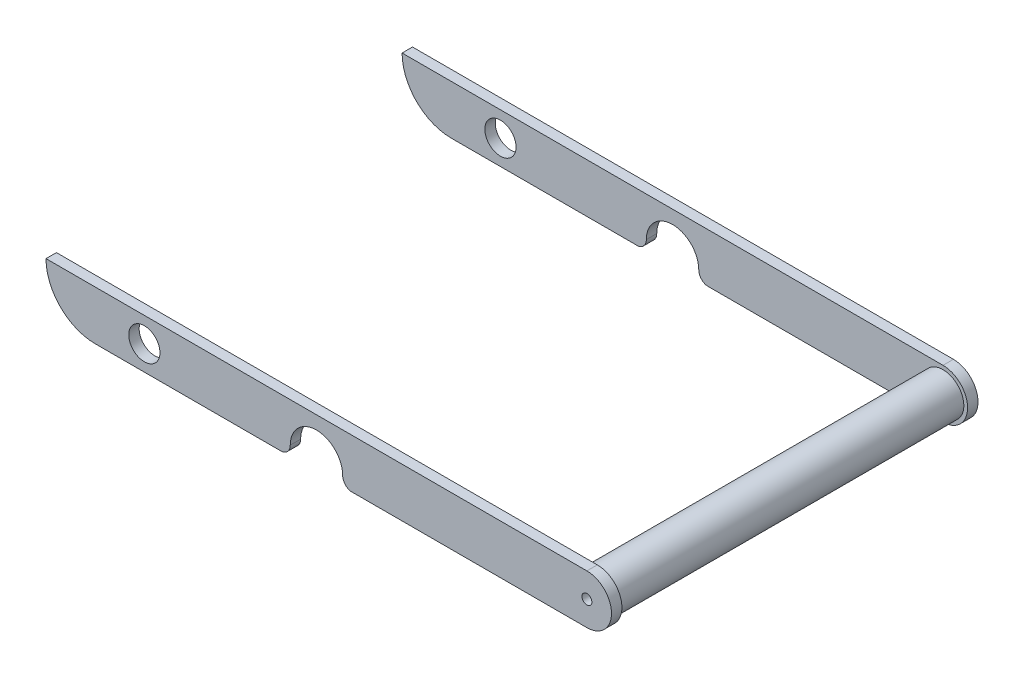
ISO-10303-21;
HEADER;
FILE_DESCRIPTION(('STEP AP214'),'2;1');
FILE_NAME('part.step','',(''),(''),'','','');
FILE_SCHEMA(('AUTOMOTIVE_DESIGN { 1 0 10303 214 1 1 1 1 }'));
ENDSEC;
DATA;
#1=APPLICATION_CONTEXT('core data for automotive mechanical design processes');
#2=APPLICATION_PROTOCOL_DEFINITION('international standard','automotive_design',2000,#1);
#3=PRODUCT_CONTEXT('',#1,'mechanical');
#4=PRODUCT('Part','Part','',(#3));
#5=PRODUCT_RELATED_PRODUCT_CATEGORY('part','',(#4));
#6=PRODUCT_DEFINITION_FORMATION('','',#4);
#7=PRODUCT_DEFINITION_CONTEXT('part definition',#1,'design');
#8=PRODUCT_DEFINITION('design','',#6,#7);
#9=PRODUCT_DEFINITION_SHAPE('','',#8);
#10=(LENGTH_UNIT() NAMED_UNIT(*) SI_UNIT(.MILLI.,.METRE.));
#11=(NAMED_UNIT(*) PLANE_ANGLE_UNIT() SI_UNIT($,.RADIAN.));
#12=(NAMED_UNIT(*) SI_UNIT($,.STERADIAN.) SOLID_ANGLE_UNIT());
#13=UNCERTAINTY_MEASURE_WITH_UNIT(LENGTH_MEASURE(1.E-05),#10,'distance_accuracy_value','');
#14=(GEOMETRIC_REPRESENTATION_CONTEXT(3) GLOBAL_UNCERTAINTY_ASSIGNED_CONTEXT((#13)) GLOBAL_UNIT_ASSIGNED_CONTEXT((#10,
#11,#12)) REPRESENTATION_CONTEXT('',''));
#15=CARTESIAN_POINT('',(0.,0.,0.));
#16=DIRECTION('',(0.,0.,1.));
#17=DIRECTION('',(1.,0.,0.));
#18=AXIS2_PLACEMENT_3D('',#15,#16,#17);
#19=CARTESIAN_POINT('',(0.,0.,3.175));
#20=DIRECTION('',(0.,1.,0.));
#21=DIRECTION('',(0.,0.,1.));
#22=AXIS2_PLACEMENT_3D('',#19,#20,#21);
#23=PLANE('',#22);
#24=DIRECTION('',(1.,0.,0.));
#25=VECTOR('',#24,1.);
#26=CARTESIAN_POINT('',(0.,0.,0.));
#27=LINE('',#26,#25);
#28=CARTESIAN_POINT('',(0.,0.,0.));
#29=VERTEX_POINT('',#28);
#30=CARTESIAN_POINT('',(57.0175182557869,0.,0.));
#31=VERTEX_POINT('',#30);
#32=EDGE_CURVE('E164',#29,#31,#27,.T.);
#33=ORIENTED_EDGE('',*,*,#32,.T.);
#34=DIRECTION('',(0.,0.,1.));
#35=VECTOR('',#34,1.);
#36=CARTESIAN_POINT('',(57.0175182557869,0.,0.));
#37=LINE('',#36,#35);
#38=CARTESIAN_POINT('',(57.0175182557869,0.,3.175));
#39=VERTEX_POINT('',#38);
#40=EDGE_CURVE('E146',#31,#39,#37,.T.);
#41=ORIENTED_EDGE('',*,*,#40,.T.);
#42=DIRECTION('',(1.,0.,0.));
#43=VECTOR('',#42,1.);
#44=CARTESIAN_POINT('',(0.,0.,3.175));
#45=LINE('',#44,#43);
#46=CARTESIAN_POINT('',(0.,0.,3.175));
#47=VERTEX_POINT('',#46);
#48=EDGE_CURVE('E260',#47,#39,#45,.T.);
#49=ORIENTED_EDGE('',*,*,#48,.F.);
#50=DIRECTION('',(0.,0.,-1.));
#51=VECTOR('',#50,1.);
#52=CARTESIAN_POINT('',(0.,0.,3.175));
#53=LINE('',#52,#51);
#54=EDGE_CURVE('E170',#47,#29,#53,.T.);
#55=ORIENTED_EDGE('',*,*,#54,.T.);
#56=EDGE_LOOP('',(#33,#41,#49,#55));
#57=FACE_BOUND('',#56,.T.);
#58=ADVANCED_FACE('F33',(#57),#23,.F.);
#59=CARTESIAN_POINT('',(0.,0.,111.7992));
#60=DIRECTION('',(0.,1.,0.));
#61=DIRECTION('',(0.,0.,1.));
#62=AXIS2_PLACEMENT_3D('',#59,#60,#61);
#63=PLANE('',#62);
#64=DIRECTION('',(1.,0.,0.));
#65=VECTOR('',#64,1.);
#66=CARTESIAN_POINT('',(0.,0.,108.6242));
#67=LINE('',#66,#65);
#68=CARTESIAN_POINT('',(0.,0.,108.6242));
#69=VERTEX_POINT('',#68);
#70=CARTESIAN_POINT('',(57.0175182557869,0.,108.6242));
#71=VERTEX_POINT('',#70);
#72=EDGE_CURVE('E206',#69,#71,#67,.T.);
#73=ORIENTED_EDGE('',*,*,#72,.T.);
#74=DIRECTION('',(0.,0.,1.));
#75=VECTOR('',#74,1.);
#76=CARTESIAN_POINT('',(57.0175182557869,0.,0.));
#77=LINE('',#76,#75);
#78=CARTESIAN_POINT('',(57.0175182557869,0.,111.7992));
#79=VERTEX_POINT('',#78);
#80=EDGE_CURVE('E41',#71,#79,#77,.T.);
#81=ORIENTED_EDGE('',*,*,#80,.T.);
#82=DIRECTION('',(1.,0.,0.));
#83=VECTOR('',#82,1.);
#84=CARTESIAN_POINT('',(0.,0.,111.7992));
#85=LINE('',#84,#83);
#86=CARTESIAN_POINT('',(0.,0.,111.7992));
#87=VERTEX_POINT('',#86);
#88=EDGE_CURVE('E204',#87,#79,#85,.T.);
#89=ORIENTED_EDGE('',*,*,#88,.F.);
#90=DIRECTION('',(0.,0.,-1.));
#91=VECTOR('',#90,1.);
#92=CARTESIAN_POINT('',(0.,0.,111.7992));
#93=LINE('',#92,#91);
#94=EDGE_CURVE('E246',#87,#69,#93,.T.);
#95=ORIENTED_EDGE('',*,*,#94,.T.);
#96=EDGE_LOOP('',(#73,#81,#89,#95));
#97=FACE_BOUND('',#96,.T.);
#98=ADVANCED_FACE('F202',(#97),#63,.F.);
#99=CARTESIAN_POINT('',(0.,15.,3.175));
#100=DIRECTION('',(0.,0.,-1.));
#101=DIRECTION('',(-1.,0.,0.));
#102=AXIS2_PLACEMENT_3D('',#99,#100,#101);
#103=PLANE('',#102);
#104=CARTESIAN_POINT('',(150.,7.5,3.175));
#105=DIRECTION('',(0.,0.,-1.));
#106=DIRECTION('',(-1.,0.,0.));
#107=AXIS2_PLACEMENT_3D('',#104,#105,#106);
#108=CIRCLE('',#107,6.35);
#109=CARTESIAN_POINT('',(143.65,7.5,3.175));
#110=VERTEX_POINT('',#109);
#111=EDGE_CURVE('E194',#110,#110,#108,.F.);
#112=ORIENTED_EDGE('',*,*,#111,.F.);
#113=EDGE_LOOP('',(#112));
#114=FACE_BOUND('',#113,.T.);
#115=ORIENTED_EDGE('',*,*,#48,.T.);
#116=CARTESIAN_POINT('',(56.5,2.95502535605488,3.175));
#117=DIRECTION('',(0.,0.,-1.));
#118=DIRECTION('',(-1.,0.,0.));
#119=AXIS2_PLACEMENT_3D('',#116,#117,#118);
#120=CIRCLE('',#119,3.);
#121=CARTESIAN_POINT('',(59.5,2.95502535605489,3.175));
#122=VERTEX_POINT('',#121);
#123=EDGE_CURVE('E153',#39,#122,#120,.F.);
#124=ORIENTED_EDGE('',*,*,#123,.T.);
#125=CARTESIAN_POINT('',(67.5,2.95502535605488,3.175));
#126=DIRECTION('',(0.,0.,-1.));
#127=DIRECTION('',(-1.,0.,0.));
#128=AXIS2_PLACEMENT_3D('',#125,#126,#127);
#129=CIRCLE('',#128,8.);
#130=CARTESIAN_POINT('',(75.5,2.95502535605488,3.175));
#131=VERTEX_POINT('',#130);
#132=EDGE_CURVE('E297',#122,#131,#129,.T.);
#133=ORIENTED_EDGE('',*,*,#132,.T.);
#134=CARTESIAN_POINT('',(78.5,2.95502535605488,3.175));
#135=DIRECTION('',(0.,0.,-1.));
#136=DIRECTION('',(-1.,0.,0.));
#137=AXIS2_PLACEMENT_3D('',#134,#135,#136);
#138=CIRCLE('',#137,3.);
#139=CARTESIAN_POINT('',(77.9824817442131,0.,3.175));
#140=VERTEX_POINT('',#139);
#141=EDGE_CURVE('E291',#131,#140,#138,.F.);
#142=ORIENTED_EDGE('',*,*,#141,.T.);
#143=CARTESIAN_POINT('',(150.,0.,3.175));
#144=VERTEX_POINT('',#143);
#145=EDGE_CURVE('E259',#140,#144,#45,.T.);
#146=ORIENTED_EDGE('',*,*,#145,.T.);
#147=CARTESIAN_POINT('',(150.,7.5,3.175));
#148=DIRECTION('',(0.,0.,1.));
#149=DIRECTION('',(1.,0.,0.));
#150=AXIS2_PLACEMENT_3D('',#147,#148,#149);
#151=CIRCLE('',#150,7.5);
#152=CARTESIAN_POINT('',(150.,15.,3.175));
#153=VERTEX_POINT('',#152);
#154=EDGE_CURVE('E262',#144,#153,#151,.T.);
#155=ORIENTED_EDGE('',*,*,#154,.T.);
#156=DIRECTION('',(-1.,0.,0.));
#157=VECTOR('',#156,1.);
#158=CARTESIAN_POINT('',(-15.,15.,3.175));
#159=LINE('',#158,#157);
#160=CARTESIAN_POINT('',(-15.,15.,3.175));
#161=VERTEX_POINT('',#160);
#162=EDGE_CURVE('E187',#153,#161,#159,.T.);
#163=ORIENTED_EDGE('',*,*,#162,.T.);
#164=CARTESIAN_POINT('',(0.,15.,3.175));
#165=DIRECTION('',(0.,0.,1.));
#166=DIRECTION('',(-1.,0.,0.));
#167=AXIS2_PLACEMENT_3D('',#164,#165,#166);
#168=CIRCLE('',#167,15.);
#169=EDGE_CURVE('E182',#161,#47,#168,.T.);
#170=ORIENTED_EDGE('',*,*,#169,.T.);
#171=EDGE_LOOP('',(#115,#124,#133,#142,#146,#155,#163,#170));
#172=FACE_BOUND('',#171,.T.);
#173=CARTESIAN_POINT('',(15.,7.5,3.175));
#174=DIRECTION('',(0.,0.,1.));
#175=DIRECTION('',(1.,0.,0.));
#176=AXIS2_PLACEMENT_3D('',#173,#174,#175);
#177=CIRCLE('',#176,4.7625);
#178=CARTESIAN_POINT('',(19.7625,7.5,3.175));
#179=VERTEX_POINT('',#178);
#180=EDGE_CURVE('E252',#179,#179,#177,.T.);
#181=ORIENTED_EDGE('',*,*,#180,.F.);
#182=EDGE_LOOP('',(#181));
#183=FACE_BOUND('',#182,.T.);
#184=ADVANCED_FACE('F266',(#114,#172,#183),#103,.F.);
#185=CARTESIAN_POINT('',(0.,15.,0.));
#186=DIRECTION('',(0.,0.,-1.));
#187=DIRECTION('',(-1.,0.,0.));
#188=AXIS2_PLACEMENT_3D('',#185,#186,#187);
#189=PLANE('',#188);
#190=CARTESIAN_POINT('',(150.,7.5,0.));
#191=DIRECTION('',(0.,0.,1.));
#192=DIRECTION('',(1.,0.,0.));
#193=AXIS2_PLACEMENT_3D('',#190,#191,#192);
#194=CIRCLE('',#193,1.51839335196105);
#195=CARTESIAN_POINT('',(151.518393351961,7.5,0.));
#196=VERTEX_POINT('',#195);
#197=EDGE_CURVE('E292',#196,#196,#194,.T.);
#198=ORIENTED_EDGE('',*,*,#197,.T.);
#199=EDGE_LOOP('',(#198));
#200=FACE_BOUND('',#199,.T.);
#201=CARTESIAN_POINT('',(56.5,2.95502535605488,0.));
#202=DIRECTION('',(0.,0.,-1.));
#203=DIRECTION('',(-1.,0.,0.));
#204=AXIS2_PLACEMENT_3D('',#201,#202,#203);
#205=CIRCLE('',#204,3.);
#206=CARTESIAN_POINT('',(59.5,2.95502535605489,0.));
#207=VERTEX_POINT('',#206);
#208=EDGE_CURVE('E150',#207,#31,#205,.T.);
#209=ORIENTED_EDGE('',*,*,#208,.T.);
#210=ORIENTED_EDGE('',*,*,#32,.F.);
#211=CARTESIAN_POINT('',(0.,15.,0.));
#212=DIRECTION('',(0.,0.,1.));
#213=DIRECTION('',(-1.,0.,0.));
#214=AXIS2_PLACEMENT_3D('',#211,#212,#213);
#215=CIRCLE('',#214,15.);
#216=CARTESIAN_POINT('',(-15.,15.,0.));
#217=VERTEX_POINT('',#216);
#218=EDGE_CURVE('E177',#217,#29,#215,.T.);
#219=ORIENTED_EDGE('',*,*,#218,.F.);
#220=DIRECTION('',(-1.,0.,0.));
#221=VECTOR('',#220,1.);
#222=CARTESIAN_POINT('',(-15.,15.,0.));
#223=LINE('',#222,#221);
#224=CARTESIAN_POINT('',(150.,15.,0.));
#225=VERTEX_POINT('',#224);
#226=EDGE_CURVE('E175',#225,#217,#223,.T.);
#227=ORIENTED_EDGE('',*,*,#226,.F.);
#228=CARTESIAN_POINT('',(150.,7.5,0.));
#229=DIRECTION('',(0.,0.,1.));
#230=DIRECTION('',(1.,0.,0.));
#231=AXIS2_PLACEMENT_3D('',#228,#229,#230);
#232=CIRCLE('',#231,7.5);
#233=CARTESIAN_POINT('',(150.,0.,0.));
#234=VERTEX_POINT('',#233);
#235=EDGE_CURVE('E172',#234,#225,#232,.T.);
#236=ORIENTED_EDGE('',*,*,#235,.F.);
#237=CARTESIAN_POINT('',(77.9824817442131,0.,0.));
#238=VERTEX_POINT('',#237);
#239=EDGE_CURVE('E173',#238,#234,#27,.T.);
#240=ORIENTED_EDGE('',*,*,#239,.F.);
#241=CARTESIAN_POINT('',(78.5,2.95502535605488,0.));
#242=DIRECTION('',(0.,0.,-1.));
#243=DIRECTION('',(1.,0.,0.));
#244=AXIS2_PLACEMENT_3D('',#241,#242,#243);
#245=CIRCLE('',#244,3.);
#246=CARTESIAN_POINT('',(75.5,2.95502535605488,0.));
#247=VERTEX_POINT('',#246);
#248=EDGE_CURVE('E48',#238,#247,#245,.T.);
#249=ORIENTED_EDGE('',*,*,#248,.T.);
#250=CARTESIAN_POINT('',(67.5,2.95502535605488,0.));
#251=DIRECTION('',(0.,0.,1.));
#252=DIRECTION('',(1.,0.,0.));
#253=AXIS2_PLACEMENT_3D('',#250,#251,#252);
#254=CIRCLE('',#253,8.);
#255=EDGE_CURVE('E158',#247,#207,#254,.T.);
#256=ORIENTED_EDGE('',*,*,#255,.T.);
#257=EDGE_LOOP('',(#209,#210,#219,#227,#236,#240,#249,#256));
#258=FACE_BOUND('',#257,.T.);
#259=CARTESIAN_POINT('',(15.,7.5,0.));
#260=DIRECTION('',(0.,0.,1.));
#261=DIRECTION('',(1.,0.,0.));
#262=AXIS2_PLACEMENT_3D('',#259,#260,#261);
#263=CIRCLE('',#262,4.7625);
#264=CARTESIAN_POINT('',(19.7625,7.5,0.));
#265=VERTEX_POINT('',#264);
#266=EDGE_CURVE('E251',#265,#265,#263,.T.);
#267=ORIENTED_EDGE('',*,*,#266,.T.);
#268=EDGE_LOOP('',(#267));
#269=FACE_BOUND('',#268,.T.);
#270=ADVANCED_FACE('F161',(#200,#258,#269),#189,.T.);
#271=CARTESIAN_POINT('',(0.,15.,3.175));
#272=DIRECTION('',(0.,0.,-1.));
#273=DIRECTION('',(-1.,0.,0.));
#274=AXIS2_PLACEMENT_3D('',#271,#272,#273);
#275=CYLINDRICAL_SURFACE('',#274,15.);
#276=ORIENTED_EDGE('',*,*,#218,.T.);
#277=ORIENTED_EDGE('',*,*,#54,.F.);
#278=ORIENTED_EDGE('',*,*,#169,.F.);
#279=DIRECTION('',(0.,0.,-1.));
#280=VECTOR('',#279,1.);
#281=CARTESIAN_POINT('',(-15.,15.,3.175));
#282=LINE('',#281,#280);
#283=EDGE_CURVE('E183',#161,#217,#282,.T.);
#284=ORIENTED_EDGE('',*,*,#283,.T.);
#285=EDGE_LOOP('',(#276,#277,#278,#284));
#286=FACE_BOUND('',#285,.T.);
#287=ADVANCED_FACE('F35',(#286),#275,.T.);
#288=ORIENTED_EDGE('',*,*,#145,.F.);
#289=DIRECTION('',(0.,0.,1.));
#290=VECTOR('',#289,1.);
#291=CARTESIAN_POINT('',(77.9824817442131,0.,0.));
#292=LINE('',#291,#290);
#293=EDGE_CURVE('E157',#238,#140,#292,.T.);
#294=ORIENTED_EDGE('',*,*,#293,.F.);
#295=ORIENTED_EDGE('',*,*,#239,.T.);
#296=DIRECTION('',(0.,0.,-1.));
#297=VECTOR('',#296,1.);
#298=CARTESIAN_POINT('',(150.,0.,3.175));
#299=LINE('',#298,#297);
#300=EDGE_CURVE('E190',#144,#234,#299,.T.);
#301=ORIENTED_EDGE('',*,*,#300,.F.);
#302=EDGE_LOOP('',(#288,#294,#295,#301));
#303=FACE_BOUND('',#302,.T.);
#304=ADVANCED_FACE('F282',(#303),#23,.F.);
#305=CARTESIAN_POINT('',(150.,7.5,3.175));
#306=DIRECTION('',(0.,0.,-1.));
#307=DIRECTION('',(-1.,0.,0.));
#308=AXIS2_PLACEMENT_3D('',#305,#306,#307);
#309=CYLINDRICAL_SURFACE('',#308,7.5);
#310=ORIENTED_EDGE('',*,*,#235,.T.);
#311=DIRECTION('',(0.,0.,-1.));
#312=VECTOR('',#311,1.);
#313=CARTESIAN_POINT('',(150.,15.,3.175));
#314=LINE('',#313,#312);
#315=EDGE_CURVE('E186',#153,#225,#314,.T.);
#316=ORIENTED_EDGE('',*,*,#315,.F.);
#317=ORIENTED_EDGE('',*,*,#154,.F.);
#318=ORIENTED_EDGE('',*,*,#300,.T.);
#319=EDGE_LOOP('',(#310,#316,#317,#318));
#320=FACE_BOUND('',#319,.T.);
#321=ADVANCED_FACE('F278',(#320),#309,.T.);
#322=CARTESIAN_POINT('',(-15.,15.,3.175));
#323=DIRECTION('',(0.,-1.,0.));
#324=DIRECTION('',(0.,0.,-1.));
#325=AXIS2_PLACEMENT_3D('',#322,#323,#324);
#326=PLANE('',#325);
#327=ORIENTED_EDGE('',*,*,#226,.T.);
#328=ORIENTED_EDGE('',*,*,#283,.F.);
#329=ORIENTED_EDGE('',*,*,#162,.F.);
#330=ORIENTED_EDGE('',*,*,#315,.T.);
#331=EDGE_LOOP('',(#327,#328,#329,#330));
#332=FACE_BOUND('',#331,.T.);
#333=ADVANCED_FACE('F272',(#332),#326,.F.);
#334=CARTESIAN_POINT('',(15.,7.5,3.175));
#335=DIRECTION('',(0.,0.,-1.));
#336=DIRECTION('',(-1.,0.,0.));
#337=AXIS2_PLACEMENT_3D('',#334,#335,#336);
#338=CYLINDRICAL_SURFACE('',#337,4.7625);
#339=ORIENTED_EDGE('',*,*,#180,.T.);
#340=EDGE_LOOP('',(#339));
#341=FACE_BOUND('',#340,.T.);
#342=ORIENTED_EDGE('',*,*,#266,.F.);
#343=EDGE_LOOP('',(#342));
#344=FACE_BOUND('',#343,.T.);
#345=ADVANCED_FACE('F351',(#341,#344),#338,.F.);
#346=CARTESIAN_POINT('',(150.,7.5,108.6242));
#347=DIRECTION('',(0.,0.,-1.));
#348=DIRECTION('',(-1.,0.,0.));
#349=AXIS2_PLACEMENT_3D('',#346,#347,#348);
#350=CYLINDRICAL_SURFACE('',#349,6.35);
#351=CARTESIAN_POINT('',(150.,7.5,108.6242));
#352=DIRECTION('',(0.,0.,1.));
#353=DIRECTION('',(1.,0.,0.));
#354=AXIS2_PLACEMENT_3D('',#351,#352,#353);
#355=CIRCLE('',#354,6.35);
#356=CARTESIAN_POINT('',(156.35,7.5,108.6242));
#357=VERTEX_POINT('',#356);
#358=EDGE_CURVE('E248',#357,#357,#355,.T.);
#359=ORIENTED_EDGE('',*,*,#358,.F.);
#360=EDGE_LOOP('',(#359));
#361=FACE_BOUND('',#360,.T.);
#362=ORIENTED_EDGE('',*,*,#111,.T.);
#363=EDGE_LOOP('',(#362));
#364=FACE_BOUND('',#363,.T.);
#365=ADVANCED_FACE('F355',(#361,#364),#350,.T.);
#366=CARTESIAN_POINT('',(0.,15.,111.7992));
#367=DIRECTION('',(0.,0.,-1.));
#368=DIRECTION('',(-1.,0.,0.));
#369=AXIS2_PLACEMENT_3D('',#366,#367,#368);
#370=PLANE('',#369);
#371=CARTESIAN_POINT('',(150.,7.5,111.7992));
#372=DIRECTION('',(0.,0.,1.));
#373=DIRECTION('',(1.,0.,0.));
#374=AXIS2_PLACEMENT_3D('',#371,#372,#373);
#375=CIRCLE('',#374,1.51839335196105);
#376=CARTESIAN_POINT('',(151.518393351961,7.5,111.7992));
#377=VERTEX_POINT('',#376);
#378=EDGE_CURVE('E381',#377,#377,#375,.T.);
#379=ORIENTED_EDGE('',*,*,#378,.F.);
#380=EDGE_LOOP('',(#379));
#381=FACE_BOUND('',#380,.T.);
#382=ORIENTED_EDGE('',*,*,#88,.T.);
#383=CARTESIAN_POINT('',(56.5,2.95502535605488,111.7992));
#384=DIRECTION('',(0.,0.,-1.));
#385=DIRECTION('',(-1.,0.,0.));
#386=AXIS2_PLACEMENT_3D('',#383,#384,#385);
#387=CIRCLE('',#386,3.);
#388=CARTESIAN_POINT('',(59.5,2.95502535605489,111.7992));
#389=VERTEX_POINT('',#388);
#390=EDGE_CURVE('E214',#389,#79,#387,.T.);
#391=ORIENTED_EDGE('',*,*,#390,.F.);
#392=CARTESIAN_POINT('',(67.5,2.95502535605488,111.7992));
#393=DIRECTION('',(0.,0.,1.));
#394=DIRECTION('',(1.,0.,0.));
#395=AXIS2_PLACEMENT_3D('',#392,#393,#394);
#396=CIRCLE('',#395,8.);
#397=CARTESIAN_POINT('',(75.5,2.95502535605488,111.7992));
#398=VERTEX_POINT('',#397);
#399=EDGE_CURVE('E167',#398,#389,#396,.T.);
#400=ORIENTED_EDGE('',*,*,#399,.F.);
#401=CARTESIAN_POINT('',(78.5,2.95502535605488,111.7992));
#402=DIRECTION('',(0.,0.,-1.));
#403=DIRECTION('',(1.,0.,0.));
#404=AXIS2_PLACEMENT_3D('',#401,#402,#403);
#405=CIRCLE('',#404,3.);
#406=CARTESIAN_POINT('',(77.9824817442131,0.,111.7992));
#407=VERTEX_POINT('',#406);
#408=EDGE_CURVE('E391',#407,#398,#405,.T.);
#409=ORIENTED_EDGE('',*,*,#408,.F.);
#410=CARTESIAN_POINT('',(150.,0.,111.7992));
#411=VERTEX_POINT('',#410);
#412=EDGE_CURVE('E219',#407,#411,#85,.T.);
#413=ORIENTED_EDGE('',*,*,#412,.T.);
#414=CARTESIAN_POINT('',(150.,7.5,111.7992));
#415=DIRECTION('',(0.,0.,1.));
#416=DIRECTION('',(1.,0.,0.));
#417=AXIS2_PLACEMENT_3D('',#414,#415,#416);
#418=CIRCLE('',#417,7.5);
#419=CARTESIAN_POINT('',(150.,15.,111.7992));
#420=VERTEX_POINT('',#419);
#421=EDGE_CURVE('E218',#411,#420,#418,.T.);
#422=ORIENTED_EDGE('',*,*,#421,.T.);
#423=DIRECTION('',(-1.,0.,0.));
#424=VECTOR('',#423,1.);
#425=CARTESIAN_POINT('',(-15.,15.,111.7992));
#426=LINE('',#425,#424);
#427=CARTESIAN_POINT('',(-15.,15.,111.7992));
#428=VERTEX_POINT('',#427);
#429=EDGE_CURVE('E221',#420,#428,#426,.T.);
#430=ORIENTED_EDGE('',*,*,#429,.T.);
#431=CARTESIAN_POINT('',(0.,15.,111.7992));
#432=DIRECTION('',(0.,0.,1.));
#433=DIRECTION('',(-1.,0.,0.));
#434=AXIS2_PLACEMENT_3D('',#431,#432,#433);
#435=CIRCLE('',#434,15.);
#436=EDGE_CURVE('E216',#428,#87,#435,.T.);
#437=ORIENTED_EDGE('',*,*,#436,.T.);
#438=EDGE_LOOP('',(#382,#391,#400,#409,#413,#422,#430,#437));
#439=FACE_BOUND('',#438,.T.);
#440=CARTESIAN_POINT('',(15.,7.5,111.7992));
#441=DIRECTION('',(0.,0.,1.));
#442=DIRECTION('',(1.,0.,0.));
#443=AXIS2_PLACEMENT_3D('',#440,#441,#442);
#444=CIRCLE('',#443,4.7625);
#445=CARTESIAN_POINT('',(19.7625,7.5,111.7992));
#446=VERTEX_POINT('',#445);
#447=EDGE_CURVE('E232',#446,#446,#444,.T.);
#448=ORIENTED_EDGE('',*,*,#447,.F.);
#449=EDGE_LOOP('',(#448));
#450=FACE_BOUND('',#449,.T.);
#451=ADVANCED_FACE('F211',(#381,#439,#450),#370,.F.);
#452=CARTESIAN_POINT('',(0.,15.,108.6242));
#453=DIRECTION('',(0.,0.,-1.));
#454=DIRECTION('',(-1.,0.,0.));
#455=AXIS2_PLACEMENT_3D('',#452,#453,#454);
#456=PLANE('',#455);
#457=CARTESIAN_POINT('',(56.5,2.95502535605488,108.6242));
#458=DIRECTION('',(0.,0.,-1.));
#459=DIRECTION('',(-1.,0.,0.));
#460=AXIS2_PLACEMENT_3D('',#457,#458,#459);
#461=CIRCLE('',#460,3.);
#462=CARTESIAN_POINT('',(59.5,2.95502535605489,108.6242));
#463=VERTEX_POINT('',#462);
#464=EDGE_CURVE('E294',#71,#463,#461,.F.);
#465=ORIENTED_EDGE('',*,*,#464,.F.);
#466=ORIENTED_EDGE('',*,*,#72,.F.);
#467=CARTESIAN_POINT('',(0.,15.,108.6242));
#468=DIRECTION('',(0.,0.,1.));
#469=DIRECTION('',(-1.,0.,0.));
#470=AXIS2_PLACEMENT_3D('',#467,#468,#469);
#471=CIRCLE('',#470,15.);
#472=CARTESIAN_POINT('',(-15.,15.,108.6242));
#473=VERTEX_POINT('',#472);
#474=EDGE_CURVE('E228',#473,#69,#471,.T.);
#475=ORIENTED_EDGE('',*,*,#474,.F.);
#476=DIRECTION('',(-1.,0.,0.));
#477=VECTOR('',#476,1.);
#478=CARTESIAN_POINT('',(-15.,15.,108.6242));
#479=LINE('',#478,#477);
#480=CARTESIAN_POINT('',(150.,15.,108.6242));
#481=VERTEX_POINT('',#480);
#482=EDGE_CURVE('E236',#481,#473,#479,.T.);
#483=ORIENTED_EDGE('',*,*,#482,.F.);
#484=CARTESIAN_POINT('',(150.,7.5,108.6242));
#485=DIRECTION('',(0.,0.,1.));
#486=DIRECTION('',(1.,0.,0.));
#487=AXIS2_PLACEMENT_3D('',#484,#485,#486);
#488=CIRCLE('',#487,7.5);
#489=CARTESIAN_POINT('',(150.,0.,108.6242));
#490=VERTEX_POINT('',#489);
#491=EDGE_CURVE('E234',#490,#481,#488,.T.);
#492=ORIENTED_EDGE('',*,*,#491,.F.);
#493=CARTESIAN_POINT('',(77.9824817442131,0.,108.6242));
#494=VERTEX_POINT('',#493);
#495=EDGE_CURVE('E231',#494,#490,#67,.T.);
#496=ORIENTED_EDGE('',*,*,#495,.F.);
#497=CARTESIAN_POINT('',(78.5,2.95502535605488,108.6242));
#498=DIRECTION('',(0.,0.,-1.));
#499=DIRECTION('',(-1.,0.,0.));
#500=AXIS2_PLACEMENT_3D('',#497,#498,#499);
#501=CIRCLE('',#500,3.);
#502=CARTESIAN_POINT('',(75.5,2.95502535605488,108.6242));
#503=VERTEX_POINT('',#502);
#504=EDGE_CURVE('E56',#503,#494,#501,.F.);
#505=ORIENTED_EDGE('',*,*,#504,.F.);
#506=CARTESIAN_POINT('',(67.5,2.95502535605488,108.6242));
#507=DIRECTION('',(0.,0.,-1.));
#508=DIRECTION('',(-1.,0.,0.));
#509=AXIS2_PLACEMENT_3D('',#506,#507,#508);
#510=CIRCLE('',#509,8.);
#511=EDGE_CURVE('E11',#463,#503,#510,.T.);
#512=ORIENTED_EDGE('',*,*,#511,.F.);
#513=EDGE_LOOP('',(#465,#466,#475,#483,#492,#496,#505,#512));
#514=FACE_BOUND('',#513,.T.);
#515=ORIENTED_EDGE('',*,*,#358,.T.);
#516=EDGE_LOOP('',(#515));
#517=FACE_BOUND('',#516,.T.);
#518=CARTESIAN_POINT('',(15.,7.5,108.6242));
#519=DIRECTION('',(0.,0.,1.));
#520=DIRECTION('',(1.,0.,0.));
#521=AXIS2_PLACEMENT_3D('',#518,#519,#520);
#522=CIRCLE('',#521,4.7625);
#523=CARTESIAN_POINT('',(19.7625,7.5,108.6242));
#524=VERTEX_POINT('',#523);
#525=EDGE_CURVE('E300',#524,#524,#522,.T.);
#526=ORIENTED_EDGE('',*,*,#525,.T.);
#527=EDGE_LOOP('',(#526));
#528=FACE_BOUND('',#527,.T.);
#529=ADVANCED_FACE('F305',(#514,#517,#528),#456,.T.);
#530=CARTESIAN_POINT('',(0.,15.,111.7992));
#531=DIRECTION('',(0.,0.,-1.));
#532=DIRECTION('',(-1.,0.,0.));
#533=AXIS2_PLACEMENT_3D('',#530,#531,#532);
#534=CYLINDRICAL_SURFACE('',#533,15.);
#535=ORIENTED_EDGE('',*,*,#474,.T.);
#536=ORIENTED_EDGE('',*,*,#94,.F.);
#537=ORIENTED_EDGE('',*,*,#436,.F.);
#538=DIRECTION('',(0.,0.,-1.));
#539=VECTOR('',#538,1.);
#540=CARTESIAN_POINT('',(-15.,15.,111.7992));
#541=LINE('',#540,#539);
#542=EDGE_CURVE('E227',#428,#473,#541,.T.);
#543=ORIENTED_EDGE('',*,*,#542,.T.);
#544=EDGE_LOOP('',(#535,#536,#537,#543));
#545=FACE_BOUND('',#544,.T.);
#546=ADVANCED_FACE('F364',(#545),#534,.T.);
#547=ORIENTED_EDGE('',*,*,#412,.F.);
#548=DIRECTION('',(0.,0.,1.));
#549=VECTOR('',#548,1.);
#550=CARTESIAN_POINT('',(77.9824817442131,0.,0.));
#551=LINE('',#550,#549);
#552=EDGE_CURVE('E197',#407,#494,#551,.F.);
#553=ORIENTED_EDGE('',*,*,#552,.T.);
#554=ORIENTED_EDGE('',*,*,#495,.T.);
#555=DIRECTION('',(0.,0.,-1.));
#556=VECTOR('',#555,1.);
#557=CARTESIAN_POINT('',(150.,0.,111.7992));
#558=LINE('',#557,#556);
#559=EDGE_CURVE('E243',#411,#490,#558,.T.);
#560=ORIENTED_EDGE('',*,*,#559,.F.);
#561=EDGE_LOOP('',(#547,#553,#554,#560));
#562=FACE_BOUND('',#561,.T.);
#563=ADVANCED_FACE('F330',(#562),#63,.F.);
#564=CARTESIAN_POINT('',(150.,7.5,111.7992));
#565=DIRECTION('',(0.,0.,-1.));
#566=DIRECTION('',(-1.,0.,0.));
#567=AXIS2_PLACEMENT_3D('',#564,#565,#566);
#568=CYLINDRICAL_SURFACE('',#567,7.5);
#569=ORIENTED_EDGE('',*,*,#491,.T.);
#570=DIRECTION('',(0.,0.,-1.));
#571=VECTOR('',#570,1.);
#572=CARTESIAN_POINT('',(150.,15.,111.7992));
#573=LINE('',#572,#571);
#574=EDGE_CURVE('E240',#420,#481,#573,.T.);
#575=ORIENTED_EDGE('',*,*,#574,.F.);
#576=ORIENTED_EDGE('',*,*,#421,.F.);
#577=ORIENTED_EDGE('',*,*,#559,.T.);
#578=EDGE_LOOP('',(#569,#575,#576,#577));
#579=FACE_BOUND('',#578,.T.);
#580=ADVANCED_FACE('F320',(#579),#568,.T.);
#581=CARTESIAN_POINT('',(-15.,15.,111.7992));
#582=DIRECTION('',(0.,-1.,0.));
#583=DIRECTION('',(1.,0.,0.));
#584=AXIS2_PLACEMENT_3D('',#581,#582,#583);
#585=PLANE('',#584);
#586=ORIENTED_EDGE('',*,*,#482,.T.);
#587=ORIENTED_EDGE('',*,*,#542,.F.);
#588=ORIENTED_EDGE('',*,*,#429,.F.);
#589=ORIENTED_EDGE('',*,*,#574,.T.);
#590=EDGE_LOOP('',(#586,#587,#588,#589));
#591=FACE_BOUND('',#590,.T.);
#592=ADVANCED_FACE('F310',(#591),#585,.F.);
#593=CARTESIAN_POINT('',(15.,7.5,111.7992));
#594=DIRECTION('',(0.,0.,-1.));
#595=DIRECTION('',(-1.,0.,0.));
#596=AXIS2_PLACEMENT_3D('',#593,#594,#595);
#597=CYLINDRICAL_SURFACE('',#596,4.7625);
#598=ORIENTED_EDGE('',*,*,#447,.T.);
#599=EDGE_LOOP('',(#598));
#600=FACE_BOUND('',#599,.T.);
#601=ORIENTED_EDGE('',*,*,#525,.F.);
#602=EDGE_LOOP('',(#601));
#603=FACE_BOUND('',#602,.T.);
#604=ADVANCED_FACE('F307',(#600,#603),#597,.F.);
#605=CARTESIAN_POINT('',(78.5,2.95502535605488,0.));
#606=DIRECTION('',(0.,0.,1.));
#607=DIRECTION('',(1.,0.,0.));
#608=AXIS2_PLACEMENT_3D('',#605,#606,#607);
#609=CYLINDRICAL_SURFACE('',#608,3.);
#610=ORIENTED_EDGE('',*,*,#504,.T.);
#611=ORIENTED_EDGE('',*,*,#552,.F.);
#612=ORIENTED_EDGE('',*,*,#408,.T.);
#613=DIRECTION('',(0.,0.,1.));
#614=VECTOR('',#613,1.);
#615=CARTESIAN_POINT('',(75.5,2.95502535605488,0.));
#616=LINE('',#615,#614);
#617=EDGE_CURVE('E284',#503,#398,#616,.T.);
#618=ORIENTED_EDGE('',*,*,#617,.F.);
#619=EDGE_LOOP('',(#610,#611,#612,#618));
#620=FACE_BOUND('',#619,.T.);
#621=ADVANCED_FACE('F309',(#620),#609,.T.);
#622=CARTESIAN_POINT('',(56.5,2.95502535605488,0.));
#623=DIRECTION('',(0.,0.,1.));
#624=DIRECTION('',(1.,0.,0.));
#625=AXIS2_PLACEMENT_3D('',#622,#623,#624);
#626=CYLINDRICAL_SURFACE('',#625,3.);
#627=ORIENTED_EDGE('',*,*,#464,.T.);
#628=DIRECTION('',(0.,0.,1.));
#629=VECTOR('',#628,1.);
#630=CARTESIAN_POINT('',(59.5,2.95502535605489,0.));
#631=LINE('',#630,#629);
#632=EDGE_CURVE('E386',#463,#389,#631,.T.);
#633=ORIENTED_EDGE('',*,*,#632,.T.);
#634=ORIENTED_EDGE('',*,*,#390,.T.);
#635=ORIENTED_EDGE('',*,*,#80,.F.);
#636=EDGE_LOOP('',(#627,#633,#634,#635));
#637=FACE_BOUND('',#636,.T.);
#638=ADVANCED_FACE('F317',(#637),#626,.T.);
#639=CARTESIAN_POINT('',(67.5,2.95502535605488,0.));
#640=DIRECTION('',(0.,0.,1.));
#641=DIRECTION('',(1.,0.,0.));
#642=AXIS2_PLACEMENT_3D('',#639,#640,#641);
#643=CYLINDRICAL_SURFACE('',#642,8.);
#644=ORIENTED_EDGE('',*,*,#511,.T.);
#645=ORIENTED_EDGE('',*,*,#617,.T.);
#646=ORIENTED_EDGE('',*,*,#399,.T.);
#647=ORIENTED_EDGE('',*,*,#632,.F.);
#648=EDGE_LOOP('',(#644,#645,#646,#647));
#649=FACE_BOUND('',#648,.T.);
#650=ADVANCED_FACE('F397',(#649),#643,.F.);
#651=CARTESIAN_POINT('',(150.,7.5,0.));
#652=DIRECTION('',(0.,0.,1.));
#653=DIRECTION('',(1.,0.,0.));
#654=AXIS2_PLACEMENT_3D('',#651,#652,#653);
#655=CYLINDRICAL_SURFACE('',#654,1.51839335196105);
#656=ORIENTED_EDGE('',*,*,#197,.F.);
#657=EDGE_LOOP('',(#656));
#658=FACE_BOUND('',#657,.T.);
#659=ORIENTED_EDGE('',*,*,#378,.T.);
#660=EDGE_LOOP('',(#659));
#661=FACE_BOUND('',#660,.T.);
#662=ADVANCED_FACE('F424',(#658,#661),#655,.F.);
#663=EDGE_CURVE('E383',#207,#122,#631,.T.);
#664=ORIENTED_EDGE('',*,*,#663,.F.);
#665=ORIENTED_EDGE('',*,*,#255,.F.);
#666=EDGE_CURVE('E286',#247,#131,#616,.T.);
#667=ORIENTED_EDGE('',*,*,#666,.T.);
#668=ORIENTED_EDGE('',*,*,#132,.F.);
#669=EDGE_LOOP('',(#664,#665,#667,#668));
#670=FACE_BOUND('',#669,.T.);
#671=ADVANCED_FACE('F413',(#670),#643,.F.);
#672=ORIENTED_EDGE('',*,*,#40,.F.);
#673=ORIENTED_EDGE('',*,*,#208,.F.);
#674=ORIENTED_EDGE('',*,*,#663,.T.);
#675=ORIENTED_EDGE('',*,*,#123,.F.);
#676=EDGE_LOOP('',(#672,#673,#674,#675));
#677=FACE_BOUND('',#676,.T.);
#678=ADVANCED_FACE('F148',(#677),#626,.T.);
#679=ORIENTED_EDGE('',*,*,#666,.F.);
#680=ORIENTED_EDGE('',*,*,#248,.F.);
#681=ORIENTED_EDGE('',*,*,#293,.T.);
#682=ORIENTED_EDGE('',*,*,#141,.F.);
#683=EDGE_LOOP('',(#679,#680,#681,#682));
#684=FACE_BOUND('',#683,.T.);
#685=ADVANCED_FACE('F319',(#684),#609,.T.);
#686=CLOSED_SHELL('',(#58,#98,#184,#270,#287,#304,#321,#333,#345,#365,#451,#529,#546,#563,#580,
#592,#604,#621,#638,#650,#662,#671,#678,#685));
#687=MANIFOLD_SOLID_BREP('B2',#686);
#688=ADVANCED_BREP_SHAPE_REPRESENTATION('',(#18,#687),#14);
#689=SHAPE_DEFINITION_REPRESENTATION(#9,#688);
ENDSEC;
END-ISO-10303-21;
